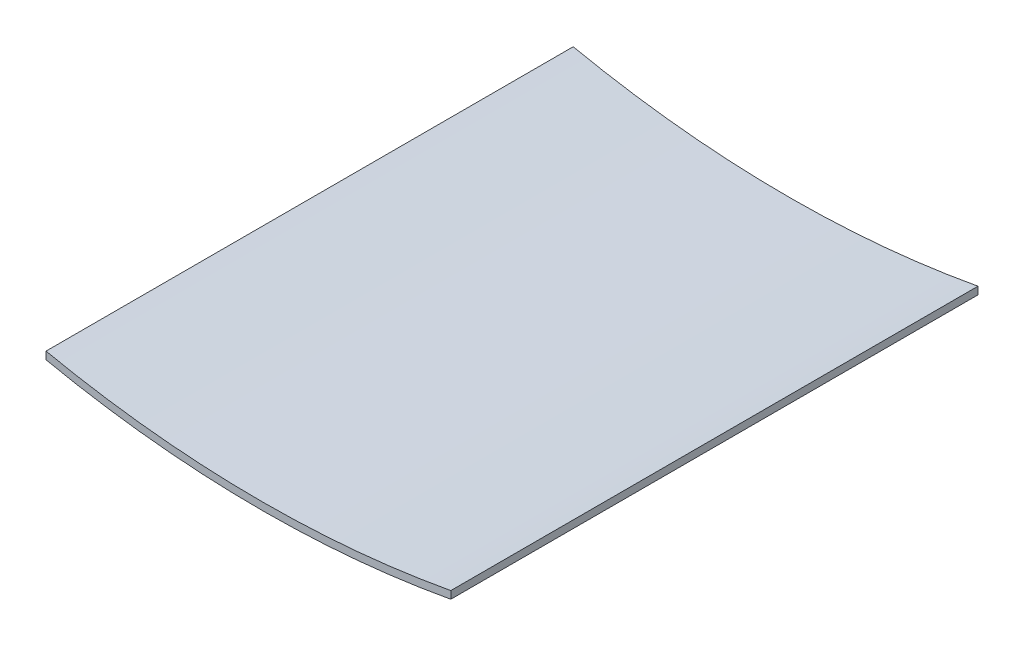
ISO-10303-21;
HEADER;
FILE_DESCRIPTION(('STEP AP214'),'2;1');
FILE_NAME('part.step','',(''),(''),'','','');
FILE_SCHEMA(('AUTOMOTIVE_DESIGN { 1 0 10303 214 1 1 1 1 }'));
ENDSEC;
DATA;
#1=APPLICATION_CONTEXT('core data for automotive mechanical design processes');
#2=APPLICATION_PROTOCOL_DEFINITION('international standard','automotive_design',2000,#1);
#3=PRODUCT_CONTEXT('',#1,'mechanical');
#4=PRODUCT('Part','Part','',(#3));
#5=PRODUCT_RELATED_PRODUCT_CATEGORY('part','',(#4));
#6=PRODUCT_DEFINITION_FORMATION('','',#4);
#7=PRODUCT_DEFINITION_CONTEXT('part definition',#1,'design');
#8=PRODUCT_DEFINITION('design','',#6,#7);
#9=PRODUCT_DEFINITION_SHAPE('','',#8);
#10=(LENGTH_UNIT() NAMED_UNIT(*) SI_UNIT(.MILLI.,.METRE.));
#11=(NAMED_UNIT(*) PLANE_ANGLE_UNIT() SI_UNIT($,.RADIAN.));
#12=(NAMED_UNIT(*) SI_UNIT($,.STERADIAN.) SOLID_ANGLE_UNIT());
#13=UNCERTAINTY_MEASURE_WITH_UNIT(LENGTH_MEASURE(1.E-05),#10,'distance_accuracy_value','');
#14=(GEOMETRIC_REPRESENTATION_CONTEXT(3) GLOBAL_UNCERTAINTY_ASSIGNED_CONTEXT((#13)) GLOBAL_UNIT_ASSIGNED_CONTEXT((#10,
#11,#12)) REPRESENTATION_CONTEXT('',''));
#15=CARTESIAN_POINT('',(0.,0.,0.));
#16=DIRECTION('',(0.,0.,1.));
#17=DIRECTION('',(1.,0.,0.));
#18=AXIS2_PLACEMENT_3D('',#15,#16,#17);
#19=CARTESIAN_POINT('',(0.,0.,266.7));
#20=DIRECTION('',(1.,0.,0.));
#21=DIRECTION('',(0.,1.,0.));
#22=AXIS2_PLACEMENT_3D('',#19,#20,#21);
#23=PLANE('',#22);
#24=DIRECTION('',(0.,-1.,0.));
#25=VECTOR('',#24,1.);
#26=CARTESIAN_POINT('',(0.,0.,266.7));
#27=LINE('',#26,#25);
#28=CARTESIAN_POINT('',(0.,-1.27000000000022,266.7));
#29=VERTEX_POINT('',#28);
#30=CARTESIAN_POINT('',(1.11022302462516E-13,-5.07999999999997,266.7));
#31=VERTEX_POINT('',#30);
#32=EDGE_CURVE('E85',#29,#31,#27,.T.);
#33=ORIENTED_EDGE('',*,*,#32,.F.);
#34=DIRECTION('',(0.,0.,-1.));
#35=VECTOR('',#34,1.);
#36=CARTESIAN_POINT('',(0.,-1.27000000000022,304.8));
#37=LINE('',#36,#35);
#38=CARTESIAN_POINT('',(0.,-1.27000000000022,0.));
#39=VERTEX_POINT('',#38);
#40=EDGE_CURVE('E95',#29,#39,#37,.T.);
#41=ORIENTED_EDGE('',*,*,#40,.T.);
#42=DIRECTION('',(0.,-1.,0.));
#43=VECTOR('',#42,1.);
#44=CARTESIAN_POINT('',(0.,0.,0.));
#45=LINE('',#44,#43);
#46=CARTESIAN_POINT('',(1.11022302462516E-13,-5.07999999999997,0.));
#47=VERTEX_POINT('',#46);
#48=EDGE_CURVE('E77',#39,#47,#45,.T.);
#49=ORIENTED_EDGE('',*,*,#48,.T.);
#50=DIRECTION('',(0.,0.,-1.));
#51=VECTOR('',#50,1.);
#52=CARTESIAN_POINT('',(1.11022302462516E-13,-5.07999999999997,266.7));
#53=LINE('',#52,#51);
#54=EDGE_CURVE('E11',#31,#47,#53,.T.);
#55=ORIENTED_EDGE('',*,*,#54,.F.);
#56=EDGE_LOOP('',(#33,#41,#49,#55));
#57=FACE_BOUND('',#56,.T.);
#58=ADVANCED_FACE('F33',(#57),#23,.F.);
#59=CARTESIAN_POINT('',(108.743750000001,511.466224482316,266.7));
#60=DIRECTION('',(0.,0.,-1.));
#61=DIRECTION('',(-1.,0.,0.));
#62=AXIS2_PLACEMENT_3D('',#59,#60,#61);
#63=CYLINDRICAL_SURFACE('',#62,527.868549158782);
#64=CARTESIAN_POINT('',(108.743750000001,511.466224482316,0.));
#65=DIRECTION('',(0.,0.,1.));
#66=DIRECTION('',(-1.,0.,0.));
#67=AXIS2_PLACEMENT_3D('',#64,#65,#66);
#68=CIRCLE('',#67,527.868549158782);
#69=CARTESIAN_POINT('',(204.7875,-7.59138626714149,0.));
#70=VERTEX_POINT('',#69);
#71=EDGE_CURVE('E68',#47,#70,#68,.T.);
#72=ORIENTED_EDGE('',*,*,#71,.T.);
#73=DIRECTION('',(0.,0.,-1.));
#74=VECTOR('',#73,1.);
#75=CARTESIAN_POINT('',(204.7875,-7.59138626714149,266.7));
#76=LINE('',#75,#74);
#77=CARTESIAN_POINT('',(204.7875,-7.59138626714149,266.7));
#78=VERTEX_POINT('',#77);
#79=EDGE_CURVE('E40',#78,#70,#76,.T.);
#80=ORIENTED_EDGE('',*,*,#79,.F.);
#81=CARTESIAN_POINT('',(108.743750000001,511.466224482316,266.7));
#82=DIRECTION('',(0.,0.,1.));
#83=DIRECTION('',(-1.,0.,0.));
#84=AXIS2_PLACEMENT_3D('',#81,#82,#83);
#85=CIRCLE('',#84,527.868549158782);
#86=EDGE_CURVE('E56',#31,#78,#85,.T.);
#87=ORIENTED_EDGE('',*,*,#86,.F.);
#88=ORIENTED_EDGE('',*,*,#54,.T.);
#89=EDGE_LOOP('',(#72,#80,#87,#88));
#90=FACE_BOUND('',#89,.T.);
#91=ADVANCED_FACE('F70',(#90),#63,.T.);
#92=CARTESIAN_POINT('',(204.7875,-2.51138626714152,266.7));
#93=DIRECTION('',(-1.,0.,0.));
#94=DIRECTION('',(0.,-1.,0.));
#95=AXIS2_PLACEMENT_3D('',#92,#93,#94);
#96=PLANE('',#95);
#97=DIRECTION('',(0.,1.,0.));
#98=VECTOR('',#97,1.);
#99=CARTESIAN_POINT('',(204.7875,-2.51138626714152,0.));
#100=LINE('',#99,#98);
#101=CARTESIAN_POINT('',(204.7875,-3.78138626714164,0.));
#102=VERTEX_POINT('',#101);
#103=EDGE_CURVE('E76',#70,#102,#100,.T.);
#104=ORIENTED_EDGE('',*,*,#103,.T.);
#105=DIRECTION('',(0.,0.,-1.));
#106=VECTOR('',#105,1.);
#107=CARTESIAN_POINT('',(204.7875,-3.78138626714164,304.8));
#108=LINE('',#107,#106);
#109=CARTESIAN_POINT('',(204.7875,-3.78138626714164,266.7));
#110=VERTEX_POINT('',#109);
#111=EDGE_CURVE('E47',#110,#102,#108,.T.);
#112=ORIENTED_EDGE('',*,*,#111,.F.);
#113=DIRECTION('',(0.,1.,0.));
#114=VECTOR('',#113,1.);
#115=CARTESIAN_POINT('',(204.7875,-2.51138626714152,266.7));
#116=LINE('',#115,#114);
#117=EDGE_CURVE('E82',#78,#110,#116,.T.);
#118=ORIENTED_EDGE('',*,*,#117,.F.);
#119=ORIENTED_EDGE('',*,*,#79,.T.);
#120=EDGE_LOOP('',(#104,#112,#118,#119));
#121=FACE_BOUND('',#120,.T.);
#122=ADVANCED_FACE('F81',(#121),#96,.F.);
#123=CARTESIAN_POINT('',(108.74375,516.546224482316,266.7));
#124=DIRECTION('',(0.,0.,-1.));
#125=DIRECTION('',(-1.,0.,0.));
#126=AXIS2_PLACEMENT_3D('',#123,#124,#125);
#127=PLANE('',#126);
#128=ORIENTED_EDGE('',*,*,#117,.T.);
#129=CARTESIAN_POINT('',(108.743750000001,515.276224482351,266.7));
#130=DIRECTION('',(0.,0.,-1.));
#131=DIRECTION('',(-1.,0.,0.));
#132=AXIS2_PLACEMENT_3D('',#129,#130,#131);
#133=CIRCLE('',#132,527.868549158816);
#134=EDGE_CURVE('E90',#110,#29,#133,.T.);
#135=ORIENTED_EDGE('',*,*,#134,.T.);
#136=ORIENTED_EDGE('',*,*,#32,.T.);
#137=ORIENTED_EDGE('',*,*,#86,.T.);
#138=EDGE_LOOP('',(#128,#135,#136,#137));
#139=FACE_BOUND('',#138,.T.);
#140=ADVANCED_FACE('F106',(#139),#127,.F.);
#141=CARTESIAN_POINT('',(108.74375,516.546224482316,0.));
#142=DIRECTION('',(0.,0.,-1.));
#143=DIRECTION('',(-1.,0.,0.));
#144=AXIS2_PLACEMENT_3D('',#141,#142,#143);
#145=PLANE('',#144);
#146=CARTESIAN_POINT('',(108.743750000001,515.276224482351,0.));
#147=DIRECTION('',(0.,0.,-1.));
#148=DIRECTION('',(-1.,0.,0.));
#149=AXIS2_PLACEMENT_3D('',#146,#147,#148);
#150=CIRCLE('',#149,527.868549158816);
#151=EDGE_CURVE('E84',#102,#39,#150,.T.);
#152=ORIENTED_EDGE('',*,*,#151,.F.);
#153=ORIENTED_EDGE('',*,*,#103,.F.);
#154=ORIENTED_EDGE('',*,*,#71,.F.);
#155=ORIENTED_EDGE('',*,*,#48,.F.);
#156=EDGE_LOOP('',(#152,#153,#154,#155));
#157=FACE_BOUND('',#156,.T.);
#158=ADVANCED_FACE('F83',(#157),#145,.T.);
#159=CARTESIAN_POINT('',(108.743750000001,515.276224482351,304.8));
#160=DIRECTION('',(0.,0.,-1.));
#161=DIRECTION('',(-1.,0.,0.));
#162=AXIS2_PLACEMENT_3D('',#159,#160,#161);
#163=CYLINDRICAL_SURFACE('',#162,527.868549158816);
#164=ORIENTED_EDGE('',*,*,#111,.T.);
#165=ORIENTED_EDGE('',*,*,#151,.T.);
#166=ORIENTED_EDGE('',*,*,#40,.F.);
#167=ORIENTED_EDGE('',*,*,#134,.F.);
#168=EDGE_LOOP('',(#164,#165,#166,#167));
#169=FACE_BOUND('',#168,.T.);
#170=ADVANCED_FACE('F101',(#169),#163,.F.);
#171=CLOSED_SHELL('',(#58,#91,#122,#140,#158,#170));
#172=MANIFOLD_SOLID_BREP('B2',#171);
#173=ADVANCED_BREP_SHAPE_REPRESENTATION('',(#18,#172),#14);
#174=SHAPE_DEFINITION_REPRESENTATION(#9,#173);
ENDSEC;
END-ISO-10303-21;
